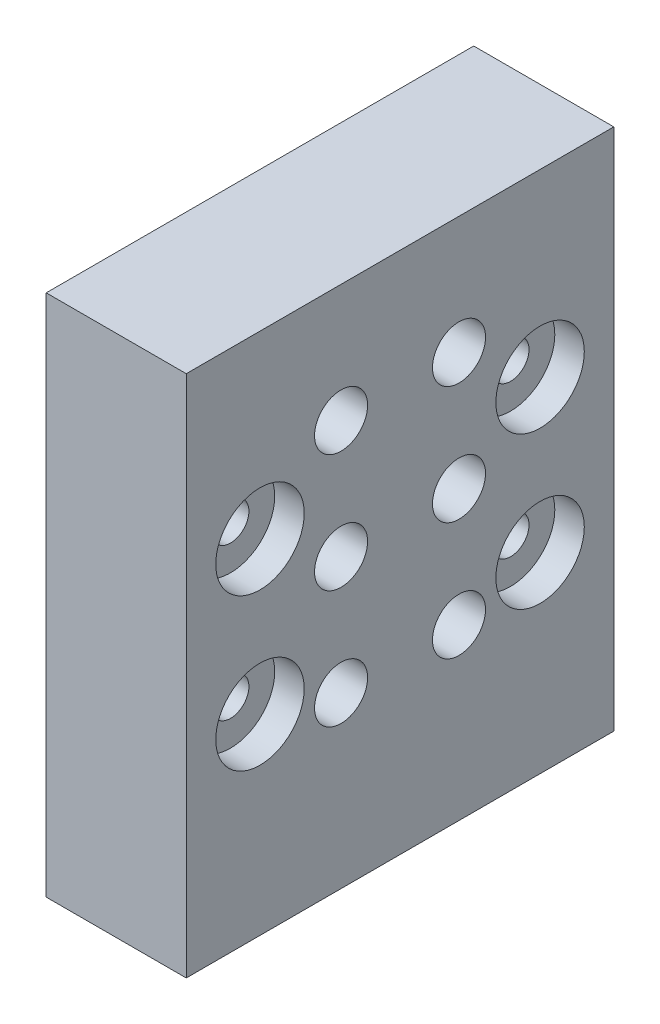
ISO-10303-21;
HEADER;
FILE_DESCRIPTION(('STEP AP214'),'2;1');
FILE_NAME('part.step','',(''),(''),'','','');
FILE_SCHEMA(('AUTOMOTIVE_DESIGN { 1 0 10303 214 1 1 1 1 }'));
ENDSEC;
DATA;
#1=APPLICATION_CONTEXT('core data for automotive mechanical design processes');
#2=APPLICATION_PROTOCOL_DEFINITION('international standard','automotive_design',2000,#1);
#3=PRODUCT_CONTEXT('',#1,'mechanical');
#4=PRODUCT('Part','Part','',(#3));
#5=PRODUCT_RELATED_PRODUCT_CATEGORY('part','',(#4));
#6=PRODUCT_DEFINITION_FORMATION('','',#4);
#7=PRODUCT_DEFINITION_CONTEXT('part definition',#1,'design');
#8=PRODUCT_DEFINITION('design','',#6,#7);
#9=PRODUCT_DEFINITION_SHAPE('','',#8);
#10=(LENGTH_UNIT() NAMED_UNIT(*) SI_UNIT(.MILLI.,.METRE.));
#11=(NAMED_UNIT(*) PLANE_ANGLE_UNIT() SI_UNIT($,.RADIAN.));
#12=(NAMED_UNIT(*) SI_UNIT($,.STERADIAN.) SOLID_ANGLE_UNIT());
#13=UNCERTAINTY_MEASURE_WITH_UNIT(LENGTH_MEASURE(1.E-05),#10,'distance_accuracy_value','');
#14=(GEOMETRIC_REPRESENTATION_CONTEXT(3) GLOBAL_UNCERTAINTY_ASSIGNED_CONTEXT((#13)) GLOBAL_UNIT_ASSIGNED_CONTEXT((#10,
#11,#12)) REPRESENTATION_CONTEXT('',''));
#15=CARTESIAN_POINT('',(0.,0.,0.));
#16=DIRECTION('',(0.,0.,1.));
#17=DIRECTION('',(1.,0.,0.));
#18=AXIS2_PLACEMENT_3D('',#15,#16,#17);
#19=CARTESIAN_POINT('',(-3.,21.3,-22.));
#20=DIRECTION('',(1.,0.,0.));
#21=DIRECTION('',(0.,0.,-1.));
#22=AXIS2_PLACEMENT_3D('',#19,#20,#21);
#23=CYLINDRICAL_SURFACE('',#22,1.25);
#24=CARTESIAN_POINT('',(0.,21.3,-22.));
#25=DIRECTION('',(-1.,0.,0.));
#26=DIRECTION('',(0.,0.,1.));
#27=AXIS2_PLACEMENT_3D('',#24,#25,#26);
#28=CIRCLE('',#27,1.25);
#29=CARTESIAN_POINT('',(0.,21.3,-20.75));
#30=VERTEX_POINT('',#29);
#31=EDGE_CURVE('E171',#30,#30,#28,.T.);
#32=ORIENTED_EDGE('',*,*,#31,.T.);
#33=EDGE_LOOP('',(#32));
#34=FACE_BOUND('',#33,.T.);
#35=CARTESIAN_POINT('',(5.5,21.3,-22.));
#36=DIRECTION('',(1.,0.,0.));
#37=DIRECTION('',(0.,0.,-1.));
#38=AXIS2_PLACEMENT_3D('',#35,#36,#37);
#39=CIRCLE('',#38,1.25);
#40=CARTESIAN_POINT('',(5.5,21.3,-23.25));
#41=VERTEX_POINT('',#40);
#42=EDGE_CURVE('E36',#41,#41,#39,.F.);
#43=ORIENTED_EDGE('',*,*,#42,.F.);
#44=EDGE_LOOP('',(#43));
#45=FACE_BOUND('',#44,.T.);
#46=ADVANCED_FACE('F32',(#34,#45),#23,.F.);
#47=CARTESIAN_POINT('',(-3.,11.,-3.));
#48=DIRECTION('',(1.,0.,0.));
#49=DIRECTION('',(0.,0.,-1.));
#50=AXIS2_PLACEMENT_3D('',#47,#48,#49);
#51=CYLINDRICAL_SURFACE('',#50,1.25);
#52=CARTESIAN_POINT('',(0.,11.,-3.));
#53=DIRECTION('',(-1.,0.,0.));
#54=DIRECTION('',(0.,0.,1.));
#55=AXIS2_PLACEMENT_3D('',#52,#53,#54);
#56=CIRCLE('',#55,1.25);
#57=CARTESIAN_POINT('',(0.,11.,-1.75));
#58=VERTEX_POINT('',#57);
#59=EDGE_CURVE('E176',#58,#58,#56,.T.);
#60=ORIENTED_EDGE('',*,*,#59,.T.);
#61=EDGE_LOOP('',(#60));
#62=FACE_BOUND('',#61,.T.);
#63=CARTESIAN_POINT('',(5.5,11.,-3.));
#64=DIRECTION('',(1.,0.,0.));
#65=DIRECTION('',(0.,0.,-1.));
#66=AXIS2_PLACEMENT_3D('',#63,#64,#65);
#67=CIRCLE('',#66,1.25);
#68=CARTESIAN_POINT('',(5.5,11.,-4.25));
#69=VERTEX_POINT('',#68);
#70=EDGE_CURVE('E190',#69,#69,#67,.F.);
#71=ORIENTED_EDGE('',*,*,#70,.F.);
#72=EDGE_LOOP('',(#71));
#73=FACE_BOUND('',#72,.T.);
#74=ADVANCED_FACE('F282',(#62,#73),#51,.F.);
#75=CARTESIAN_POINT('',(-3.,21.3,-3.));
#76=DIRECTION('',(1.,0.,0.));
#77=DIRECTION('',(0.,0.,-1.));
#78=AXIS2_PLACEMENT_3D('',#75,#76,#77);
#79=CYLINDRICAL_SURFACE('',#78,1.25);
#80=CARTESIAN_POINT('',(0.,21.3,-3.));
#81=DIRECTION('',(-1.,0.,0.));
#82=DIRECTION('',(0.,0.,1.));
#83=AXIS2_PLACEMENT_3D('',#80,#81,#82);
#84=CIRCLE('',#83,1.25);
#85=CARTESIAN_POINT('',(0.,21.3,-1.75));
#86=VERTEX_POINT('',#85);
#87=EDGE_CURVE('E179',#86,#86,#84,.T.);
#88=ORIENTED_EDGE('',*,*,#87,.T.);
#89=EDGE_LOOP('',(#88));
#90=FACE_BOUND('',#89,.T.);
#91=CARTESIAN_POINT('',(5.5,21.3,-3.));
#92=DIRECTION('',(1.,0.,0.));
#93=DIRECTION('',(0.,0.,-1.));
#94=AXIS2_PLACEMENT_3D('',#91,#92,#93);
#95=CIRCLE('',#94,1.25);
#96=CARTESIAN_POINT('',(5.5,21.3,-4.25));
#97=VERTEX_POINT('',#96);
#98=EDGE_CURVE('E187',#97,#97,#95,.F.);
#99=ORIENTED_EDGE('',*,*,#98,.F.);
#100=EDGE_LOOP('',(#99));
#101=FACE_BOUND('',#100,.T.);
#102=ADVANCED_FACE('F288',(#90,#101),#79,.F.);
#103=CARTESIAN_POINT('',(-3.,11.,-22.));
#104=DIRECTION('',(1.,0.,0.));
#105=DIRECTION('',(0.,0.,-1.));
#106=AXIS2_PLACEMENT_3D('',#103,#104,#105);
#107=CYLINDRICAL_SURFACE('',#106,1.25);
#108=CARTESIAN_POINT('',(0.,11.,-22.));
#109=DIRECTION('',(-1.,0.,0.));
#110=DIRECTION('',(0.,0.,1.));
#111=AXIS2_PLACEMENT_3D('',#108,#109,#110);
#112=CIRCLE('',#111,1.25);
#113=CARTESIAN_POINT('',(0.,11.,-20.75));
#114=VERTEX_POINT('',#113);
#115=EDGE_CURVE('E172',#114,#114,#112,.T.);
#116=ORIENTED_EDGE('',*,*,#115,.T.);
#117=EDGE_LOOP('',(#116));
#118=FACE_BOUND('',#117,.T.);
#119=CARTESIAN_POINT('',(5.5,11.,-22.));
#120=DIRECTION('',(1.,0.,0.));
#121=DIRECTION('',(0.,0.,-1.));
#122=AXIS2_PLACEMENT_3D('',#119,#120,#121);
#123=CIRCLE('',#122,1.25);
#124=CARTESIAN_POINT('',(5.5,11.,-23.25));
#125=VERTEX_POINT('',#124);
#126=EDGE_CURVE('E184',#125,#125,#123,.F.);
#127=ORIENTED_EDGE('',*,*,#126,.F.);
#128=EDGE_LOOP('',(#127));
#129=FACE_BOUND('',#128,.T.);
#130=ADVANCED_FACE('F240',(#118,#129),#107,.F.);
#131=CARTESIAN_POINT('',(0.,0.,0.));
#132=DIRECTION('',(-1.,0.,0.));
#133=DIRECTION('',(0.,0.,1.));
#134=AXIS2_PLACEMENT_3D('',#131,#132,#133);
#135=PLANE('',#134);
#136=CARTESIAN_POINT('',(0.,25.5,-16.5));
#137=DIRECTION('',(-1.,0.,0.));
#138=DIRECTION('',(0.,0.,1.));
#139=AXIS2_PLACEMENT_3D('',#136,#137,#138);
#140=CIRCLE('',#139,1.8);
#141=CARTESIAN_POINT('',(0.,25.5,-14.7));
#142=VERTEX_POINT('',#141);
#143=EDGE_CURVE('E123',#142,#142,#140,.T.);
#144=ORIENTED_EDGE('',*,*,#143,.F.);
#145=EDGE_LOOP('',(#144));
#146=FACE_BOUND('',#145,.T.);
#147=CARTESIAN_POINT('',(0.,17.5,-16.5));
#148=DIRECTION('',(-1.,0.,0.));
#149=DIRECTION('',(0.,0.,1.));
#150=AXIS2_PLACEMENT_3D('',#147,#148,#149);
#151=CIRCLE('',#150,1.8);
#152=CARTESIAN_POINT('',(0.,17.5,-14.7));
#153=VERTEX_POINT('',#152);
#154=EDGE_CURVE('E126',#153,#153,#151,.T.);
#155=ORIENTED_EDGE('',*,*,#154,.F.);
#156=EDGE_LOOP('',(#155));
#157=FACE_BOUND('',#156,.T.);
#158=CARTESIAN_POINT('',(0.,9.5,-16.5));
#159=DIRECTION('',(-1.,0.,0.));
#160=DIRECTION('',(0.,0.,1.));
#161=AXIS2_PLACEMENT_3D('',#158,#159,#160);
#162=CIRCLE('',#161,1.8);
#163=CARTESIAN_POINT('',(0.,9.5,-14.7));
#164=VERTEX_POINT('',#163);
#165=EDGE_CURVE('E230',#164,#164,#162,.T.);
#166=ORIENTED_EDGE('',*,*,#165,.F.);
#167=EDGE_LOOP('',(#166));
#168=FACE_BOUND('',#167,.T.);
#169=CARTESIAN_POINT('',(0.,9.5,-8.5));
#170=DIRECTION('',(-1.,0.,0.));
#171=DIRECTION('',(0.,0.,1.));
#172=AXIS2_PLACEMENT_3D('',#169,#170,#171);
#173=CIRCLE('',#172,1.8);
#174=CARTESIAN_POINT('',(0.,9.5,-6.70000000000001));
#175=VERTEX_POINT('',#174);
#176=EDGE_CURVE('E227',#175,#175,#173,.T.);
#177=ORIENTED_EDGE('',*,*,#176,.F.);
#178=EDGE_LOOP('',(#177));
#179=FACE_BOUND('',#178,.T.);
#180=CARTESIAN_POINT('',(0.,17.5,-8.5));
#181=DIRECTION('',(-1.,0.,0.));
#182=DIRECTION('',(0.,0.,1.));
#183=AXIS2_PLACEMENT_3D('',#180,#181,#182);
#184=CIRCLE('',#183,1.8);
#185=CARTESIAN_POINT('',(0.,17.5,-6.70000000000001));
#186=VERTEX_POINT('',#185);
#187=EDGE_CURVE('E224',#186,#186,#184,.T.);
#188=ORIENTED_EDGE('',*,*,#187,.F.);
#189=EDGE_LOOP('',(#188));
#190=FACE_BOUND('',#189,.T.);
#191=CARTESIAN_POINT('',(0.,25.5,-8.5));
#192=DIRECTION('',(-1.,0.,0.));
#193=DIRECTION('',(0.,0.,1.));
#194=AXIS2_PLACEMENT_3D('',#191,#192,#193);
#195=CIRCLE('',#194,1.8);
#196=CARTESIAN_POINT('',(0.,25.5,-6.7));
#197=VERTEX_POINT('',#196);
#198=EDGE_CURVE('E221',#197,#197,#195,.T.);
#199=ORIENTED_EDGE('',*,*,#198,.F.);
#200=EDGE_LOOP('',(#199));
#201=FACE_BOUND('',#200,.T.);
#202=ORIENTED_EDGE('',*,*,#115,.F.);
#203=EDGE_LOOP('',(#202));
#204=FACE_BOUND('',#203,.T.);
#205=ORIENTED_EDGE('',*,*,#87,.F.);
#206=EDGE_LOOP('',(#205));
#207=FACE_BOUND('',#206,.T.);
#208=ORIENTED_EDGE('',*,*,#59,.F.);
#209=EDGE_LOOP('',(#208));
#210=FACE_BOUND('',#209,.T.);
#211=ORIENTED_EDGE('',*,*,#31,.F.);
#212=EDGE_LOOP('',(#211));
#213=FACE_BOUND('',#212,.T.);
#214=DIRECTION('',(0.,0.,-1.));
#215=VECTOR('',#214,1.);
#216=CARTESIAN_POINT('',(0.,0.,0.));
#217=LINE('',#216,#215);
#218=CARTESIAN_POINT('',(0.,0.,0.));
#219=VERTEX_POINT('',#218);
#220=CARTESIAN_POINT('',(0.,0.,-25.));
#221=VERTEX_POINT('',#220);
#222=EDGE_CURVE('E41',#219,#221,#217,.T.);
#223=ORIENTED_EDGE('',*,*,#222,.F.);
#224=DIRECTION('',(0.,-1.,0.));
#225=VECTOR('',#224,1.);
#226=CARTESIAN_POINT('',(0.,31.5,0.));
#227=LINE('',#226,#225);
#228=CARTESIAN_POINT('',(0.,31.5,0.));
#229=VERTEX_POINT('',#228);
#230=EDGE_CURVE('E145',#229,#219,#227,.T.);
#231=ORIENTED_EDGE('',*,*,#230,.F.);
#232=DIRECTION('',(0.,0.,1.));
#233=VECTOR('',#232,1.);
#234=CARTESIAN_POINT('',(0.,31.5,0.));
#235=LINE('',#234,#233);
#236=CARTESIAN_POINT('',(0.,31.5,-25.));
#237=VERTEX_POINT('',#236);
#238=EDGE_CURVE('E11',#237,#229,#235,.T.);
#239=ORIENTED_EDGE('',*,*,#238,.F.);
#240=DIRECTION('',(0.,1.,0.));
#241=VECTOR('',#240,1.);
#242=CARTESIAN_POINT('',(0.,31.5,-25.));
#243=LINE('',#242,#241);
#244=EDGE_CURVE('E158',#221,#237,#243,.T.);
#245=ORIENTED_EDGE('',*,*,#244,.F.);
#246=EDGE_LOOP('',(#223,#231,#239,#245));
#247=FACE_BOUND('',#246,.T.);
#248=ADVANCED_FACE('F34',(#146,#157,#168,#179,#190,#201,#204,#207,#210,#213,#247),#135,.T.);
#249=CARTESIAN_POINT('',(0.,0.,2.));
#250=DIRECTION('',(0.,0.,1.));
#251=DIRECTION('',(1.,0.,0.));
#252=AXIS2_PLACEMENT_3D('',#249,#250,#251);
#253=PLANE('',#252);
#254=DIRECTION('',(-1.,0.,0.));
#255=VECTOR('',#254,1.);
#256=CARTESIAN_POINT('',(2.,-2.,2.));
#257=LINE('',#256,#255);
#258=CARTESIAN_POINT('',(7.5,-2.,2.));
#259=VERTEX_POINT('',#258);
#260=CARTESIAN_POINT('',(-2.,-2.,2.));
#261=VERTEX_POINT('',#260);
#262=EDGE_CURVE('E96',#259,#261,#257,.T.);
#263=ORIENTED_EDGE('',*,*,#262,.F.);
#264=DIRECTION('',(0.,-1.,0.));
#265=VECTOR('',#264,1.);
#266=CARTESIAN_POINT('',(7.5,33.5,2.));
#267=LINE('',#266,#265);
#268=CARTESIAN_POINT('',(7.5,33.5,2.));
#269=VERTEX_POINT('',#268);
#270=EDGE_CURVE('E101',#269,#259,#267,.T.);
#271=ORIENTED_EDGE('',*,*,#270,.F.);
#272=DIRECTION('',(1.,0.,0.));
#273=VECTOR('',#272,1.);
#274=CARTESIAN_POINT('',(-2.,33.5,2.));
#275=LINE('',#274,#273);
#276=CARTESIAN_POINT('',(-2.,33.5,2.));
#277=VERTEX_POINT('',#276);
#278=EDGE_CURVE('E140',#277,#269,#275,.T.);
#279=ORIENTED_EDGE('',*,*,#278,.F.);
#280=DIRECTION('',(0.,1.,0.));
#281=VECTOR('',#280,1.);
#282=CARTESIAN_POINT('',(-2.,31.5,2.));
#283=LINE('',#282,#281);
#284=EDGE_CURVE('E102',#261,#277,#283,.T.);
#285=ORIENTED_EDGE('',*,*,#284,.F.);
#286=EDGE_LOOP('',(#263,#271,#279,#285));
#287=FACE_BOUND('',#286,.T.);
#288=ADVANCED_FACE('F98',(#287),#253,.T.);
#289=CARTESIAN_POINT('',(0.,0.,-27.));
#290=DIRECTION('',(0.,0.,-1.));
#291=DIRECTION('',(-1.,0.,0.));
#292=AXIS2_PLACEMENT_3D('',#289,#290,#291);
#293=PLANE('',#292);
#294=DIRECTION('',(-1.,0.,0.));
#295=VECTOR('',#294,1.);
#296=CARTESIAN_POINT('',(-2.,33.5,-27.));
#297=LINE('',#296,#295);
#298=CARTESIAN_POINT('',(7.5,33.5,-27.));
#299=VERTEX_POINT('',#298);
#300=CARTESIAN_POINT('',(-2.,33.5,-27.));
#301=VERTEX_POINT('',#300);
#302=EDGE_CURVE('E142',#299,#301,#297,.T.);
#303=ORIENTED_EDGE('',*,*,#302,.F.);
#304=DIRECTION('',(0.,1.,0.));
#305=VECTOR('',#304,1.);
#306=CARTESIAN_POINT('',(7.5,33.5,-27.));
#307=LINE('',#306,#305);
#308=CARTESIAN_POINT('',(7.5,-2.,-27.));
#309=VERTEX_POINT('',#308);
#310=EDGE_CURVE('E117',#309,#299,#307,.T.);
#311=ORIENTED_EDGE('',*,*,#310,.F.);
#312=DIRECTION('',(1.,0.,0.));
#313=VECTOR('',#312,1.);
#314=CARTESIAN_POINT('',(2.,-2.,-27.));
#315=LINE('',#314,#313);
#316=CARTESIAN_POINT('',(-2.,-2.,-27.));
#317=VERTEX_POINT('',#316);
#318=EDGE_CURVE('E113',#317,#309,#315,.T.);
#319=ORIENTED_EDGE('',*,*,#318,.F.);
#320=DIRECTION('',(0.,-1.,0.));
#321=VECTOR('',#320,1.);
#322=CARTESIAN_POINT('',(-2.,31.5,-27.));
#323=LINE('',#322,#321);
#324=EDGE_CURVE('E159',#301,#317,#323,.T.);
#325=ORIENTED_EDGE('',*,*,#324,.F.);
#326=EDGE_LOOP('',(#303,#311,#319,#325));
#327=FACE_BOUND('',#326,.T.);
#328=ADVANCED_FACE('F301',(#327),#293,.T.);
#329=CARTESIAN_POINT('',(-2.,31.5,-25.));
#330=DIRECTION('',(0.,0.,-1.));
#331=DIRECTION('',(-1.,0.,0.));
#332=AXIS2_PLACEMENT_3D('',#329,#330,#331);
#333=PLANE('',#332);
#334=ORIENTED_EDGE('',*,*,#244,.T.);
#335=DIRECTION('',(1.,0.,0.));
#336=VECTOR('',#335,1.);
#337=CARTESIAN_POINT('',(-2.,31.5,-25.));
#338=LINE('',#337,#336);
#339=CARTESIAN_POINT('',(-2.,31.5,-25.));
#340=VERTEX_POINT('',#339);
#341=EDGE_CURVE('E164',#340,#237,#338,.T.);
#342=ORIENTED_EDGE('',*,*,#341,.F.);
#343=DIRECTION('',(0.,1.,0.));
#344=VECTOR('',#343,1.);
#345=CARTESIAN_POINT('',(-2.,31.5,-25.));
#346=LINE('',#345,#344);
#347=CARTESIAN_POINT('',(-2.,0.,-25.));
#348=VERTEX_POINT('',#347);
#349=EDGE_CURVE('E161',#348,#340,#346,.T.);
#350=ORIENTED_EDGE('',*,*,#349,.F.);
#351=DIRECTION('',(1.,0.,0.));
#352=VECTOR('',#351,1.);
#353=CARTESIAN_POINT('',(-2.,0.,-25.));
#354=LINE('',#353,#352);
#355=EDGE_CURVE('E168',#348,#221,#354,.T.);
#356=ORIENTED_EDGE('',*,*,#355,.T.);
#357=EDGE_LOOP('',(#334,#342,#350,#356));
#358=FACE_BOUND('',#357,.T.);
#359=ADVANCED_FACE('F262',(#358),#333,.F.);
#360=CARTESIAN_POINT('',(-2.,0.,0.));
#361=DIRECTION('',(-1.,0.,0.));
#362=DIRECTION('',(0.,0.,1.));
#363=AXIS2_PLACEMENT_3D('',#360,#361,#362);
#364=PLANE('',#363);
#365=DIRECTION('',(0.,0.,-1.));
#366=VECTOR('',#365,1.);
#367=CARTESIAN_POINT('',(-2.,-2.,2.));
#368=LINE('',#367,#366);
#369=EDGE_CURVE('E106',#261,#317,#368,.T.);
#370=ORIENTED_EDGE('',*,*,#369,.F.);
#371=ORIENTED_EDGE('',*,*,#284,.T.);
#372=DIRECTION('',(0.,0.,1.));
#373=VECTOR('',#372,1.);
#374=CARTESIAN_POINT('',(-2.,33.5,-27.));
#375=LINE('',#374,#373);
#376=EDGE_CURVE('E137',#301,#277,#375,.T.);
#377=ORIENTED_EDGE('',*,*,#376,.F.);
#378=ORIENTED_EDGE('',*,*,#324,.T.);
#379=EDGE_LOOP('',(#370,#371,#377,#378));
#380=FACE_BOUND('',#379,.T.);
#381=DIRECTION('',(0.,-1.,0.));
#382=VECTOR('',#381,1.);
#383=CARTESIAN_POINT('',(-2.,31.5,0.));
#384=LINE('',#383,#382);
#385=CARTESIAN_POINT('',(-2.,31.5,0.));
#386=VERTEX_POINT('',#385);
#387=CARTESIAN_POINT('',(-2.,0.,0.));
#388=VERTEX_POINT('',#387);
#389=EDGE_CURVE('E149',#386,#388,#384,.T.);
#390=ORIENTED_EDGE('',*,*,#389,.T.);
#391=DIRECTION('',(0.,0.,-1.));
#392=VECTOR('',#391,1.);
#393=CARTESIAN_POINT('',(-2.,0.,2.));
#394=LINE('',#393,#392);
#395=EDGE_CURVE('E107',#388,#348,#394,.T.);
#396=ORIENTED_EDGE('',*,*,#395,.T.);
#397=ORIENTED_EDGE('',*,*,#349,.T.);
#398=DIRECTION('',(0.,0.,1.));
#399=VECTOR('',#398,1.);
#400=CARTESIAN_POINT('',(-2.,31.5,-27.));
#401=LINE('',#400,#399);
#402=EDGE_CURVE('E134',#340,#386,#401,.T.);
#403=ORIENTED_EDGE('',*,*,#402,.T.);
#404=EDGE_LOOP('',(#390,#396,#397,#403));
#405=FACE_BOUND('',#404,.T.);
#406=ADVANCED_FACE('F265',(#380,#405),#364,.T.);
#407=CARTESIAN_POINT('',(-2.,31.5,0.));
#408=DIRECTION('',(0.,0.,1.));
#409=DIRECTION('',(1.,0.,0.));
#410=AXIS2_PLACEMENT_3D('',#407,#408,#409);
#411=PLANE('',#410);
#412=ORIENTED_EDGE('',*,*,#230,.T.);
#413=DIRECTION('',(1.,0.,0.));
#414=VECTOR('',#413,1.);
#415=CARTESIAN_POINT('',(-2.,0.,0.));
#416=LINE('',#415,#414);
#417=EDGE_CURVE('E152',#388,#219,#416,.T.);
#418=ORIENTED_EDGE('',*,*,#417,.F.);
#419=ORIENTED_EDGE('',*,*,#389,.F.);
#420=DIRECTION('',(1.,0.,0.));
#421=VECTOR('',#420,1.);
#422=CARTESIAN_POINT('',(-2.,31.5,0.));
#423=LINE('',#422,#421);
#424=EDGE_CURVE('E156',#386,#229,#423,.T.);
#425=ORIENTED_EDGE('',*,*,#424,.T.);
#426=EDGE_LOOP('',(#412,#418,#419,#425));
#427=FACE_BOUND('',#426,.T.);
#428=ADVANCED_FACE('F269',(#427),#411,.F.);
#429=CARTESIAN_POINT('',(0.,31.5,0.));
#430=DIRECTION('',(0.,1.,0.));
#431=DIRECTION('',(0.,0.,1.));
#432=AXIS2_PLACEMENT_3D('',#429,#430,#431);
#433=PLANE('',#432);
#434=ORIENTED_EDGE('',*,*,#402,.F.);
#435=ORIENTED_EDGE('',*,*,#341,.T.);
#436=ORIENTED_EDGE('',*,*,#238,.T.);
#437=ORIENTED_EDGE('',*,*,#424,.F.);
#438=EDGE_LOOP('',(#434,#435,#436,#437));
#439=FACE_BOUND('',#438,.T.);
#440=ADVANCED_FACE('F270',(#439),#433,.F.);
#441=CARTESIAN_POINT('',(0.,33.5,0.));
#442=DIRECTION('',(0.,1.,0.));
#443=DIRECTION('',(0.,0.,1.));
#444=AXIS2_PLACEMENT_3D('',#441,#442,#443);
#445=PLANE('',#444);
#446=ORIENTED_EDGE('',*,*,#376,.T.);
#447=ORIENTED_EDGE('',*,*,#278,.T.);
#448=DIRECTION('',(0.,0.,1.));
#449=VECTOR('',#448,1.);
#450=CARTESIAN_POINT('',(7.5,33.5,2.));
#451=LINE('',#450,#449);
#452=EDGE_CURVE('E122',#299,#269,#451,.T.);
#453=ORIENTED_EDGE('',*,*,#452,.F.);
#454=ORIENTED_EDGE('',*,*,#302,.T.);
#455=EDGE_LOOP('',(#446,#447,#453,#454));
#456=FACE_BOUND('',#455,.T.);
#457=ADVANCED_FACE('F272',(#456),#445,.T.);
#458=CARTESIAN_POINT('',(0.,-2.,0.));
#459=DIRECTION('',(0.,1.,0.));
#460=DIRECTION('',(0.,0.,1.));
#461=AXIS2_PLACEMENT_3D('',#458,#459,#460);
#462=PLANE('',#461);
#463=ORIENTED_EDGE('',*,*,#318,.T.);
#464=DIRECTION('',(0.,0.,-1.));
#465=VECTOR('',#464,1.);
#466=CARTESIAN_POINT('',(7.5,-2.,2.));
#467=LINE('',#466,#465);
#468=EDGE_CURVE('E110',#259,#309,#467,.T.);
#469=ORIENTED_EDGE('',*,*,#468,.F.);
#470=ORIENTED_EDGE('',*,*,#262,.T.);
#471=ORIENTED_EDGE('',*,*,#369,.T.);
#472=EDGE_LOOP('',(#463,#469,#470,#471));
#473=FACE_BOUND('',#472,.T.);
#474=ADVANCED_FACE('F111',(#473),#462,.F.);
#475=CARTESIAN_POINT('',(0.,0.,0.));
#476=DIRECTION('',(0.,1.,0.));
#477=DIRECTION('',(0.,0.,1.));
#478=AXIS2_PLACEMENT_3D('',#475,#476,#477);
#479=PLANE('',#478);
#480=ORIENTED_EDGE('',*,*,#395,.F.);
#481=ORIENTED_EDGE('',*,*,#417,.T.);
#482=ORIENTED_EDGE('',*,*,#222,.T.);
#483=ORIENTED_EDGE('',*,*,#355,.F.);
#484=EDGE_LOOP('',(#480,#481,#482,#483));
#485=FACE_BOUND('',#484,.T.);
#486=ADVANCED_FACE('F263',(#485),#479,.T.);
#487=CARTESIAN_POINT('',(7.5,0.,0.));
#488=DIRECTION('',(1.,0.,0.));
#489=DIRECTION('',(0.,0.,-1.));
#490=AXIS2_PLACEMENT_3D('',#487,#488,#489);
#491=PLANE('',#490);
#492=CARTESIAN_POINT('',(7.5,21.3,-22.));
#493=DIRECTION('',(1.,0.,0.));
#494=DIRECTION('',(0.,0.,-1.));
#495=AXIS2_PLACEMENT_3D('',#492,#493,#494);
#496=CIRCLE('',#495,3.);
#497=CARTESIAN_POINT('',(7.5,21.3,-25.));
#498=VERTEX_POINT('',#497);
#499=EDGE_CURVE('E549',#498,#498,#496,.T.);
#500=ORIENTED_EDGE('',*,*,#499,.F.);
#501=EDGE_LOOP('',(#500));
#502=FACE_BOUND('',#501,.T.);
#503=CARTESIAN_POINT('',(7.5,11.,-22.));
#504=DIRECTION('',(1.,0.,0.));
#505=DIRECTION('',(0.,0.,-1.));
#506=AXIS2_PLACEMENT_3D('',#503,#504,#505);
#507=CIRCLE('',#506,3.);
#508=CARTESIAN_POINT('',(7.5,11.,-25.));
#509=VERTEX_POINT('',#508);
#510=EDGE_CURVE('E553',#509,#509,#507,.T.);
#511=ORIENTED_EDGE('',*,*,#510,.F.);
#512=EDGE_LOOP('',(#511));
#513=FACE_BOUND('',#512,.T.);
#514=CARTESIAN_POINT('',(7.5,11.,-3.));
#515=DIRECTION('',(1.,0.,0.));
#516=DIRECTION('',(0.,0.,-1.));
#517=AXIS2_PLACEMENT_3D('',#514,#515,#516);
#518=CIRCLE('',#517,3.);
#519=CARTESIAN_POINT('',(7.5,11.,-6.));
#520=VERTEX_POINT('',#519);
#521=EDGE_CURVE('E557',#520,#520,#518,.T.);
#522=ORIENTED_EDGE('',*,*,#521,.F.);
#523=EDGE_LOOP('',(#522));
#524=FACE_BOUND('',#523,.T.);
#525=CARTESIAN_POINT('',(7.5,21.3,-3.));
#526=DIRECTION('',(1.,0.,0.));
#527=DIRECTION('',(0.,0.,-1.));
#528=AXIS2_PLACEMENT_3D('',#525,#526,#527);
#529=CIRCLE('',#528,3.);
#530=CARTESIAN_POINT('',(7.5,21.3,-6.));
#531=VERTEX_POINT('',#530);
#532=EDGE_CURVE('E208',#531,#531,#529,.T.);
#533=ORIENTED_EDGE('',*,*,#532,.F.);
#534=EDGE_LOOP('',(#533));
#535=FACE_BOUND('',#534,.T.);
#536=CARTESIAN_POINT('',(7.5,25.5,-16.5));
#537=DIRECTION('',(1.,0.,0.));
#538=DIRECTION('',(0.,0.,-1.));
#539=AXIS2_PLACEMENT_3D('',#536,#537,#538);
#540=CIRCLE('',#539,1.8);
#541=CARTESIAN_POINT('',(7.5,25.5,-18.3));
#542=VERTEX_POINT('',#541);
#543=EDGE_CURVE('E210',#542,#542,#540,.T.);
#544=ORIENTED_EDGE('',*,*,#543,.F.);
#545=EDGE_LOOP('',(#544));
#546=FACE_BOUND('',#545,.T.);
#547=CARTESIAN_POINT('',(7.5,17.5,-16.5));
#548=DIRECTION('',(1.,0.,0.));
#549=DIRECTION('',(0.,0.,-1.));
#550=AXIS2_PLACEMENT_3D('',#547,#548,#549);
#551=CIRCLE('',#550,1.8);
#552=CARTESIAN_POINT('',(7.5,17.5,-18.3));
#553=VERTEX_POINT('',#552);
#554=EDGE_CURVE('E214',#553,#553,#551,.T.);
#555=ORIENTED_EDGE('',*,*,#554,.F.);
#556=EDGE_LOOP('',(#555));
#557=FACE_BOUND('',#556,.T.);
#558=CARTESIAN_POINT('',(7.5,9.5,-16.5));
#559=DIRECTION('',(1.,0.,0.));
#560=DIRECTION('',(0.,0.,-1.));
#561=AXIS2_PLACEMENT_3D('',#558,#559,#560);
#562=CIRCLE('',#561,1.8);
#563=CARTESIAN_POINT('',(7.5,9.5,-18.3));
#564=VERTEX_POINT('',#563);
#565=EDGE_CURVE('E204',#564,#564,#562,.T.);
#566=ORIENTED_EDGE('',*,*,#565,.F.);
#567=EDGE_LOOP('',(#566));
#568=FACE_BOUND('',#567,.T.);
#569=CARTESIAN_POINT('',(7.5,9.5,-8.5));
#570=DIRECTION('',(1.,0.,0.));
#571=DIRECTION('',(0.,0.,-1.));
#572=AXIS2_PLACEMENT_3D('',#569,#570,#571);
#573=CIRCLE('',#572,1.8);
#574=CARTESIAN_POINT('',(7.5,9.5,-10.3));
#575=VERTEX_POINT('',#574);
#576=EDGE_CURVE('E199',#575,#575,#573,.T.);
#577=ORIENTED_EDGE('',*,*,#576,.F.);
#578=EDGE_LOOP('',(#577));
#579=FACE_BOUND('',#578,.T.);
#580=CARTESIAN_POINT('',(7.5,17.5,-8.5));
#581=DIRECTION('',(1.,0.,0.));
#582=DIRECTION('',(0.,0.,-1.));
#583=AXIS2_PLACEMENT_3D('',#580,#581,#582);
#584=CIRCLE('',#583,1.8);
#585=CARTESIAN_POINT('',(7.5,17.5,-10.3));
#586=VERTEX_POINT('',#585);
#587=EDGE_CURVE('E195',#586,#586,#584,.T.);
#588=ORIENTED_EDGE('',*,*,#587,.F.);
#589=EDGE_LOOP('',(#588));
#590=FACE_BOUND('',#589,.T.);
#591=CARTESIAN_POINT('',(7.5,25.5,-8.5));
#592=DIRECTION('',(1.,0.,0.));
#593=DIRECTION('',(0.,0.,-1.));
#594=AXIS2_PLACEMENT_3D('',#591,#592,#593);
#595=CIRCLE('',#594,1.8);
#596=CARTESIAN_POINT('',(7.5,25.5,-10.3));
#597=VERTEX_POINT('',#596);
#598=EDGE_CURVE('E213',#597,#597,#595,.T.);
#599=ORIENTED_EDGE('',*,*,#598,.F.);
#600=EDGE_LOOP('',(#599));
#601=FACE_BOUND('',#600,.T.);
#602=ORIENTED_EDGE('',*,*,#270,.T.);
#603=ORIENTED_EDGE('',*,*,#468,.T.);
#604=ORIENTED_EDGE('',*,*,#310,.T.);
#605=ORIENTED_EDGE('',*,*,#452,.T.);
#606=EDGE_LOOP('',(#602,#603,#604,#605));
#607=FACE_BOUND('',#606,.T.);
#608=ADVANCED_FACE('F120',(#502,#513,#524,#535,#546,#557,#568,#579,#590,#601,#607),#491,.T.);
#609=CARTESIAN_POINT('',(-6.,25.5,-8.5));
#610=DIRECTION('',(1.,0.,0.));
#611=DIRECTION('',(0.,0.,-1.));
#612=AXIS2_PLACEMENT_3D('',#609,#610,#611);
#613=CYLINDRICAL_SURFACE('',#612,1.8);
#614=ORIENTED_EDGE('',*,*,#198,.T.);
#615=EDGE_LOOP('',(#614));
#616=FACE_BOUND('',#615,.T.);
#617=ORIENTED_EDGE('',*,*,#598,.T.);
#618=EDGE_LOOP('',(#617));
#619=FACE_BOUND('',#618,.T.);
#620=ADVANCED_FACE('F373',(#616,#619),#613,.F.);
#621=CARTESIAN_POINT('',(-6.,17.5,-8.5));
#622=DIRECTION('',(1.,0.,0.));
#623=DIRECTION('',(0.,0.,-1.));
#624=AXIS2_PLACEMENT_3D('',#621,#622,#623);
#625=CYLINDRICAL_SURFACE('',#624,1.8);
#626=ORIENTED_EDGE('',*,*,#187,.T.);
#627=EDGE_LOOP('',(#626));
#628=FACE_BOUND('',#627,.T.);
#629=ORIENTED_EDGE('',*,*,#587,.T.);
#630=EDGE_LOOP('',(#629));
#631=FACE_BOUND('',#630,.T.);
#632=ADVANCED_FACE('F378',(#628,#631),#625,.F.);
#633=CARTESIAN_POINT('',(-6.,9.5,-8.5));
#634=DIRECTION('',(1.,0.,0.));
#635=DIRECTION('',(0.,0.,-1.));
#636=AXIS2_PLACEMENT_3D('',#633,#634,#635);
#637=CYLINDRICAL_SURFACE('',#636,1.8);
#638=ORIENTED_EDGE('',*,*,#176,.T.);
#639=EDGE_LOOP('',(#638));
#640=FACE_BOUND('',#639,.T.);
#641=ORIENTED_EDGE('',*,*,#576,.T.);
#642=EDGE_LOOP('',(#641));
#643=FACE_BOUND('',#642,.T.);
#644=ADVANCED_FACE('F388',(#640,#643),#637,.F.);
#645=CARTESIAN_POINT('',(-6.,9.5,-16.5));
#646=DIRECTION('',(1.,0.,0.));
#647=DIRECTION('',(0.,0.,-1.));
#648=AXIS2_PLACEMENT_3D('',#645,#646,#647);
#649=CYLINDRICAL_SURFACE('',#648,1.8);
#650=ORIENTED_EDGE('',*,*,#165,.T.);
#651=EDGE_LOOP('',(#650));
#652=FACE_BOUND('',#651,.T.);
#653=ORIENTED_EDGE('',*,*,#565,.T.);
#654=EDGE_LOOP('',(#653));
#655=FACE_BOUND('',#654,.T.);
#656=ADVANCED_FACE('F398',(#652,#655),#649,.F.);
#657=CARTESIAN_POINT('',(-6.,17.5,-16.5));
#658=DIRECTION('',(1.,0.,0.));
#659=DIRECTION('',(0.,0.,-1.));
#660=AXIS2_PLACEMENT_3D('',#657,#658,#659);
#661=CYLINDRICAL_SURFACE('',#660,1.8);
#662=ORIENTED_EDGE('',*,*,#154,.T.);
#663=EDGE_LOOP('',(#662));
#664=FACE_BOUND('',#663,.T.);
#665=ORIENTED_EDGE('',*,*,#554,.T.);
#666=EDGE_LOOP('',(#665));
#667=FACE_BOUND('',#666,.T.);
#668=ADVANCED_FACE('F235',(#664,#667),#661,.F.);
#669=CARTESIAN_POINT('',(-6.,25.5,-16.5));
#670=DIRECTION('',(1.,0.,0.));
#671=DIRECTION('',(0.,0.,-1.));
#672=AXIS2_PLACEMENT_3D('',#669,#670,#671);
#673=CYLINDRICAL_SURFACE('',#672,1.8);
#674=ORIENTED_EDGE('',*,*,#143,.T.);
#675=EDGE_LOOP('',(#674));
#676=FACE_BOUND('',#675,.T.);
#677=ORIENTED_EDGE('',*,*,#543,.T.);
#678=EDGE_LOOP('',(#677));
#679=FACE_BOUND('',#678,.T.);
#680=ADVANCED_FACE('F416',(#676,#679),#673,.F.);
#681=CARTESIAN_POINT('',(5.5,21.3,-3.));
#682=DIRECTION('',(1.,0.,0.));
#683=DIRECTION('',(0.,0.,-1.));
#684=AXIS2_PLACEMENT_3D('',#681,#682,#683);
#685=PLANE('',#684);
#686=CARTESIAN_POINT('',(5.5,21.3,-3.));
#687=DIRECTION('',(1.,0.,0.));
#688=DIRECTION('',(0.,0.,-1.));
#689=AXIS2_PLACEMENT_3D('',#686,#687,#688);
#690=CIRCLE('',#689,3.);
#691=CARTESIAN_POINT('',(5.5,21.3,-6.));
#692=VERTEX_POINT('',#691);
#693=EDGE_CURVE('E188',#692,#692,#690,.T.);
#694=ORIENTED_EDGE('',*,*,#693,.T.);
#695=EDGE_LOOP('',(#694));
#696=FACE_BOUND('',#695,.T.);
#697=ORIENTED_EDGE('',*,*,#98,.T.);
#698=EDGE_LOOP('',(#697));
#699=FACE_BOUND('',#698,.T.);
#700=ADVANCED_FACE('F424',(#696,#699),#685,.T.);
#701=CARTESIAN_POINT('',(5.5,21.3,-3.));
#702=DIRECTION('',(1.,0.,0.));
#703=DIRECTION('',(0.,0.,-1.));
#704=AXIS2_PLACEMENT_3D('',#701,#702,#703);
#705=CYLINDRICAL_SURFACE('',#704,3.);
#706=ORIENTED_EDGE('',*,*,#693,.F.);
#707=EDGE_LOOP('',(#706));
#708=FACE_BOUND('',#707,.T.);
#709=ORIENTED_EDGE('',*,*,#532,.T.);
#710=EDGE_LOOP('',(#709));
#711=FACE_BOUND('',#710,.T.);
#712=ADVANCED_FACE('F461',(#708,#711),#705,.F.);
#713=CARTESIAN_POINT('',(5.5,11.,-3.));
#714=DIRECTION('',(1.,0.,0.));
#715=DIRECTION('',(0.,0.,-1.));
#716=AXIS2_PLACEMENT_3D('',#713,#714,#715);
#717=PLANE('',#716);
#718=CARTESIAN_POINT('',(5.5,11.,-3.));
#719=DIRECTION('',(1.,0.,0.));
#720=DIRECTION('',(0.,0.,-1.));
#721=AXIS2_PLACEMENT_3D('',#718,#719,#720);
#722=CIRCLE('',#721,3.);
#723=CARTESIAN_POINT('',(5.5,11.,-6.));
#724=VERTEX_POINT('',#723);
#725=EDGE_CURVE('E576',#724,#724,#722,.T.);
#726=ORIENTED_EDGE('',*,*,#725,.T.);
#727=EDGE_LOOP('',(#726));
#728=FACE_BOUND('',#727,.T.);
#729=ORIENTED_EDGE('',*,*,#70,.T.);
#730=EDGE_LOOP('',(#729));
#731=FACE_BOUND('',#730,.T.);
#732=ADVANCED_FACE('F470',(#728,#731),#717,.T.);
#733=CARTESIAN_POINT('',(5.5,11.,-3.));
#734=DIRECTION('',(1.,0.,0.));
#735=DIRECTION('',(0.,0.,-1.));
#736=AXIS2_PLACEMENT_3D('',#733,#734,#735);
#737=CYLINDRICAL_SURFACE('',#736,3.);
#738=ORIENTED_EDGE('',*,*,#725,.F.);
#739=EDGE_LOOP('',(#738));
#740=FACE_BOUND('',#739,.T.);
#741=ORIENTED_EDGE('',*,*,#521,.T.);
#742=EDGE_LOOP('',(#741));
#743=FACE_BOUND('',#742,.T.);
#744=ADVANCED_FACE('F478',(#740,#743),#737,.F.);
#745=CARTESIAN_POINT('',(5.5,11.,-22.));
#746=DIRECTION('',(1.,0.,0.));
#747=DIRECTION('',(0.,0.,-1.));
#748=AXIS2_PLACEMENT_3D('',#745,#746,#747);
#749=PLANE('',#748);
#750=CARTESIAN_POINT('',(5.5,11.,-22.));
#751=DIRECTION('',(1.,0.,0.));
#752=DIRECTION('',(0.,0.,-1.));
#753=AXIS2_PLACEMENT_3D('',#750,#751,#752);
#754=CIRCLE('',#753,3.);
#755=CARTESIAN_POINT('',(5.5,11.,-25.));
#756=VERTEX_POINT('',#755);
#757=EDGE_CURVE('E581',#756,#756,#754,.T.);
#758=ORIENTED_EDGE('',*,*,#757,.T.);
#759=EDGE_LOOP('',(#758));
#760=FACE_BOUND('',#759,.T.);
#761=ORIENTED_EDGE('',*,*,#126,.T.);
#762=EDGE_LOOP('',(#761));
#763=FACE_BOUND('',#762,.T.);
#764=ADVANCED_FACE('F486',(#760,#763),#749,.T.);
#765=CARTESIAN_POINT('',(5.5,11.,-22.));
#766=DIRECTION('',(1.,0.,0.));
#767=DIRECTION('',(0.,0.,-1.));
#768=AXIS2_PLACEMENT_3D('',#765,#766,#767);
#769=CYLINDRICAL_SURFACE('',#768,3.);
#770=ORIENTED_EDGE('',*,*,#757,.F.);
#771=EDGE_LOOP('',(#770));
#772=FACE_BOUND('',#771,.T.);
#773=ORIENTED_EDGE('',*,*,#510,.T.);
#774=EDGE_LOOP('',(#773));
#775=FACE_BOUND('',#774,.T.);
#776=ADVANCED_FACE('F494',(#772,#775),#769,.F.);
#777=CARTESIAN_POINT('',(5.5,21.3,-22.));
#778=DIRECTION('',(1.,0.,0.));
#779=DIRECTION('',(0.,0.,-1.));
#780=AXIS2_PLACEMENT_3D('',#777,#778,#779);
#781=PLANE('',#780);
#782=CARTESIAN_POINT('',(5.5,21.3,-22.));
#783=DIRECTION('',(1.,0.,0.));
#784=DIRECTION('',(0.,0.,-1.));
#785=AXIS2_PLACEMENT_3D('',#782,#783,#784);
#786=CIRCLE('',#785,3.);
#787=CARTESIAN_POINT('',(5.5,21.3,-25.));
#788=VERTEX_POINT('',#787);
#789=EDGE_CURVE('E587',#788,#788,#786,.T.);
#790=ORIENTED_EDGE('',*,*,#789,.T.);
#791=EDGE_LOOP('',(#790));
#792=FACE_BOUND('',#791,.T.);
#793=ORIENTED_EDGE('',*,*,#42,.T.);
#794=EDGE_LOOP('',(#793));
#795=FACE_BOUND('',#794,.T.);
#796=ADVANCED_FACE('F502',(#792,#795),#781,.T.);
#797=CARTESIAN_POINT('',(5.5,21.3,-22.));
#798=DIRECTION('',(1.,0.,0.));
#799=DIRECTION('',(0.,0.,-1.));
#800=AXIS2_PLACEMENT_3D('',#797,#798,#799);
#801=CYLINDRICAL_SURFACE('',#800,3.);
#802=ORIENTED_EDGE('',*,*,#789,.F.);
#803=EDGE_LOOP('',(#802));
#804=FACE_BOUND('',#803,.T.);
#805=ORIENTED_EDGE('',*,*,#499,.T.);
#806=EDGE_LOOP('',(#805));
#807=FACE_BOUND('',#806,.T.);
#808=ADVANCED_FACE('F510',(#804,#807),#801,.F.);
#809=CLOSED_SHELL('',(#46,#74,#102,#130,#248,#288,#328,#359,#406,#428,#440,#457,#474,#486,#608,
#620,#632,#644,#656,#668,#680,#700,#712,#732,#744,#764,#776,#796,#808));
#810=MANIFOLD_SOLID_BREP('B2',#809);
#811=ADVANCED_BREP_SHAPE_REPRESENTATION('',(#18,#810),#14);
#812=SHAPE_DEFINITION_REPRESENTATION(#9,#811);
ENDSEC;
END-ISO-10303-21;
